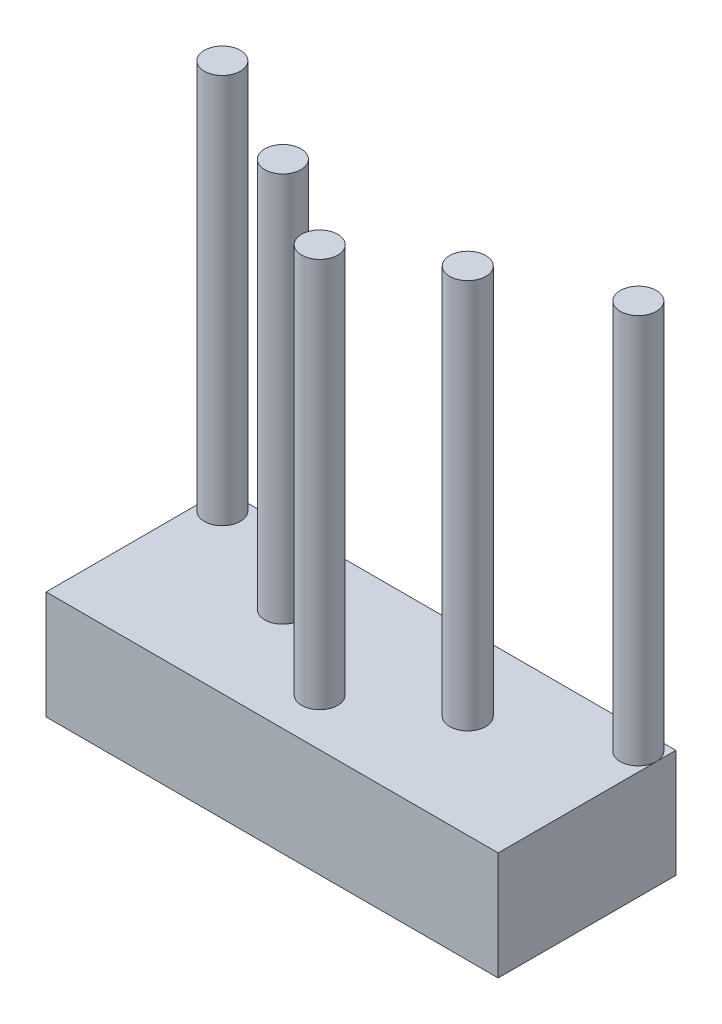
ISO-10303-21;
HEADER;
FILE_DESCRIPTION(('STEP AP214'),'2;1');
FILE_NAME('part.step','',(''),(''),'','','');
FILE_SCHEMA(('AUTOMOTIVE_DESIGN { 1 0 10303 214 1 1 1 1 }'));
ENDSEC;
DATA;
#1=APPLICATION_CONTEXT('core data for automotive mechanical design processes');
#2=APPLICATION_PROTOCOL_DEFINITION('international standard','automotive_design',2000,#1);
#3=PRODUCT_CONTEXT('',#1,'mechanical');
#4=PRODUCT('Part','Part','',(#3));
#5=PRODUCT_RELATED_PRODUCT_CATEGORY('part','',(#4));
#6=PRODUCT_DEFINITION_FORMATION('','',#4);
#7=PRODUCT_DEFINITION_CONTEXT('part definition',#1,'design');
#8=PRODUCT_DEFINITION('design','',#6,#7);
#9=PRODUCT_DEFINITION_SHAPE('','',#8);
#10=(LENGTH_UNIT() NAMED_UNIT(*) SI_UNIT(.MILLI.,.METRE.));
#11=(NAMED_UNIT(*) PLANE_ANGLE_UNIT() SI_UNIT($,.RADIAN.));
#12=(NAMED_UNIT(*) SI_UNIT($,.STERADIAN.) SOLID_ANGLE_UNIT());
#13=UNCERTAINTY_MEASURE_WITH_UNIT(LENGTH_MEASURE(1.E-05),#10,'distance_accuracy_value','');
#14=(GEOMETRIC_REPRESENTATION_CONTEXT(3) GLOBAL_UNCERTAINTY_ASSIGNED_CONTEXT((#13)) GLOBAL_UNIT_ASSIGNED_CONTEXT((#10,
#11,#12)) REPRESENTATION_CONTEXT('',''));
#15=CARTESIAN_POINT('',(0.,0.,0.));
#16=DIRECTION('',(0.,0.,1.));
#17=DIRECTION('',(1.,0.,0.));
#18=AXIS2_PLACEMENT_3D('',#15,#16,#17);
#19=CARTESIAN_POINT('',(-39.751,19.05,-15.621));
#20=DIRECTION('',(1.,0.,0.));
#21=DIRECTION('',(0.,0.,-1.));
#22=AXIS2_PLACEMENT_3D('',#19,#20,#21);
#23=PLANE('',#22);
#24=DIRECTION('',(0.,0.,1.));
#25=VECTOR('',#24,1.);
#26=CARTESIAN_POINT('',(-39.751,0.,-15.621));
#27=LINE('',#26,#25);
#28=CARTESIAN_POINT('',(-39.751,0.,-15.621));
#29=VERTEX_POINT('',#28);
#30=CARTESIAN_POINT('',(-39.751,0.,15.621));
#31=VERTEX_POINT('',#30);
#32=EDGE_CURVE('E110',#29,#31,#27,.T.);
#33=ORIENTED_EDGE('',*,*,#32,.T.);
#34=DIRECTION('',(0.,-1.,0.));
#35=VECTOR('',#34,1.);
#36=CARTESIAN_POINT('',(-39.751,19.05,15.621));
#37=LINE('',#36,#35);
#38=CARTESIAN_POINT('',(-39.751,19.05,15.621));
#39=VERTEX_POINT('',#38);
#40=EDGE_CURVE('E11',#39,#31,#37,.T.);
#41=ORIENTED_EDGE('',*,*,#40,.F.);
#42=DIRECTION('',(0.,0.,1.));
#43=VECTOR('',#42,1.);
#44=CARTESIAN_POINT('',(-39.751,19.05,-15.621));
#45=LINE('',#44,#43);
#46=CARTESIAN_POINT('',(-39.751,19.05,-12.192));
#47=VERTEX_POINT('',#46);
#48=EDGE_CURVE('E85',#47,#39,#45,.T.);
#49=ORIENTED_EDGE('',*,*,#48,.F.);
#50=CARTESIAN_POINT('',(-39.751,19.05,-15.621));
#51=VERTEX_POINT('',#50);
#52=EDGE_CURVE('E89',#51,#47,#45,.T.);
#53=ORIENTED_EDGE('',*,*,#52,.F.);
#54=DIRECTION('',(0.,-1.,0.));
#55=VECTOR('',#54,1.);
#56=CARTESIAN_POINT('',(-39.751,19.05,-15.621));
#57=LINE('',#56,#55);
#58=EDGE_CURVE('E109',#51,#29,#57,.T.);
#59=ORIENTED_EDGE('',*,*,#58,.T.);
#60=EDGE_LOOP('',(#33,#41,#49,#53,#59));
#61=FACE_BOUND('',#60,.T.);
#62=ADVANCED_FACE('F37',(#61),#23,.F.);
#63=CARTESIAN_POINT('',(-39.751,19.05,15.621));
#64=DIRECTION('',(0.,0.,-1.));
#65=DIRECTION('',(-1.,0.,0.));
#66=AXIS2_PLACEMENT_3D('',#63,#64,#65);
#67=PLANE('',#66);
#68=DIRECTION('',(1.,0.,0.));
#69=VECTOR('',#68,1.);
#70=CARTESIAN_POINT('',(-39.751,0.,15.621));
#71=LINE('',#70,#69);
#72=CARTESIAN_POINT('',(39.751,0.,15.621));
#73=VERTEX_POINT('',#72);
#74=EDGE_CURVE('E112',#31,#73,#71,.T.);
#75=ORIENTED_EDGE('',*,*,#74,.T.);
#76=DIRECTION('',(0.,-1.,0.));
#77=VECTOR('',#76,1.);
#78=CARTESIAN_POINT('',(39.751,19.05,15.621));
#79=LINE('',#78,#77);
#80=CARTESIAN_POINT('',(39.751,19.05,15.621));
#81=VERTEX_POINT('',#80);
#82=EDGE_CURVE('E44',#81,#73,#79,.T.);
#83=ORIENTED_EDGE('',*,*,#82,.F.);
#84=DIRECTION('',(1.,0.,0.));
#85=VECTOR('',#84,1.);
#86=CARTESIAN_POINT('',(-39.751,19.05,15.621));
#87=LINE('',#86,#85);
#88=EDGE_CURVE('E95',#39,#81,#87,.T.);
#89=ORIENTED_EDGE('',*,*,#88,.F.);
#90=ORIENTED_EDGE('',*,*,#40,.T.);
#91=EDGE_LOOP('',(#75,#83,#89,#90));
#92=FACE_BOUND('',#91,.T.);
#93=ADVANCED_FACE('F131',(#92),#67,.F.);
#94=CARTESIAN_POINT('',(39.751,19.05,-15.621));
#95=DIRECTION('',(-1.,0.,0.));
#96=DIRECTION('',(0.,0.,1.));
#97=AXIS2_PLACEMENT_3D('',#94,#95,#96);
#98=PLANE('',#97);
#99=DIRECTION('',(0.,0.,-1.));
#100=VECTOR('',#99,1.);
#101=CARTESIAN_POINT('',(39.751,0.,-15.621));
#102=LINE('',#101,#100);
#103=CARTESIAN_POINT('',(39.751,0.,-15.621));
#104=VERTEX_POINT('',#103);
#105=EDGE_CURVE('E99',#73,#104,#102,.T.);
#106=ORIENTED_EDGE('',*,*,#105,.T.);
#107=DIRECTION('',(0.,-1.,0.));
#108=VECTOR('',#107,1.);
#109=CARTESIAN_POINT('',(39.751,19.05,-15.621));
#110=LINE('',#109,#108);
#111=CARTESIAN_POINT('',(39.751,19.05,-15.621));
#112=VERTEX_POINT('',#111);
#113=EDGE_CURVE('E117',#112,#104,#110,.T.);
#114=ORIENTED_EDGE('',*,*,#113,.F.);
#115=DIRECTION('',(0.,0.,-1.));
#116=VECTOR('',#115,1.);
#117=CARTESIAN_POINT('',(39.751,19.05,-15.621));
#118=LINE('',#117,#116);
#119=CARTESIAN_POINT('',(39.751,19.05,-12.192));
#120=VERTEX_POINT('',#119);
#121=EDGE_CURVE('E105',#120,#112,#118,.T.);
#122=ORIENTED_EDGE('',*,*,#121,.F.);
#123=EDGE_CURVE('E106',#81,#120,#118,.T.);
#124=ORIENTED_EDGE('',*,*,#123,.F.);
#125=ORIENTED_EDGE('',*,*,#82,.T.);
#126=EDGE_LOOP('',(#106,#114,#122,#124,#125));
#127=FACE_BOUND('',#126,.T.);
#128=ADVANCED_FACE('F123',(#127),#98,.F.);
#129=CARTESIAN_POINT('',(-39.751,19.05,-15.621));
#130=DIRECTION('',(0.,0.,1.));
#131=DIRECTION('',(1.,0.,0.));
#132=AXIS2_PLACEMENT_3D('',#129,#130,#131);
#133=PLANE('',#132);
#134=DIRECTION('',(-1.,0.,0.));
#135=VECTOR('',#134,1.);
#136=CARTESIAN_POINT('',(-39.751,0.,-15.621));
#137=LINE('',#136,#135);
#138=EDGE_CURVE('E78',#104,#29,#137,.T.);
#139=ORIENTED_EDGE('',*,*,#138,.T.);
#140=ORIENTED_EDGE('',*,*,#58,.F.);
#141=DIRECTION('',(-1.,0.,0.));
#142=VECTOR('',#141,1.);
#143=CARTESIAN_POINT('',(-39.751,19.05,-15.621));
#144=LINE('',#143,#142);
#145=EDGE_CURVE('E57',#112,#51,#144,.T.);
#146=ORIENTED_EDGE('',*,*,#145,.F.);
#147=ORIENTED_EDGE('',*,*,#113,.T.);
#148=EDGE_LOOP('',(#139,#140,#146,#147));
#149=FACE_BOUND('',#148,.T.);
#150=ADVANCED_FACE('F130',(#149),#133,.F.);
#151=CARTESIAN_POINT('',(0.,19.05,0.));
#152=DIRECTION('',(0.,1.,0.));
#153=DIRECTION('',(0.,0.,1.));
#154=AXIS2_PLACEMENT_3D('',#151,#152,#153);
#155=PLANE('',#154);
#156=CARTESIAN_POINT('',(16.256,19.05,-2.51513147919641));
#157=DIRECTION('',(0.,1.,0.));
#158=DIRECTION('',(0.,0.,1.));
#159=AXIS2_PLACEMENT_3D('',#156,#157,#158);
#160=CIRCLE('',#159,3.17499999999999);
#161=CARTESIAN_POINT('',(16.256,19.05,0.659868520803584));
#162=VERTEX_POINT('',#161);
#163=EDGE_CURVE('E190',#162,#162,#160,.T.);
#164=ORIENTED_EDGE('',*,*,#163,.F.);
#165=EDGE_LOOP('',(#164));
#166=FACE_BOUND('',#165,.T.);
#167=CARTESIAN_POINT('',(0.,19.05,7.26386852080359));
#168=DIRECTION('',(0.,1.,0.));
#169=DIRECTION('',(0.,0.,1.));
#170=AXIS2_PLACEMENT_3D('',#167,#168,#169);
#171=CIRCLE('',#170,3.17499999999999);
#172=CARTESIAN_POINT('',(0.,19.05,10.4388685208036));
#173=VERTEX_POINT('',#172);
#174=EDGE_CURVE('E198',#173,#173,#171,.T.);
#175=ORIENTED_EDGE('',*,*,#174,.F.);
#176=EDGE_LOOP('',(#175));
#177=FACE_BOUND('',#176,.T.);
#178=CARTESIAN_POINT('',(-16.256,19.05,-2.51513147919641));
#179=DIRECTION('',(0.,1.,0.));
#180=DIRECTION('',(0.,0.,1.));
#181=AXIS2_PLACEMENT_3D('',#178,#179,#180);
#182=CIRCLE('',#181,3.17499999999999);
#183=CARTESIAN_POINT('',(-16.256,19.05,0.659868520803584));
#184=VERTEX_POINT('',#183);
#185=EDGE_CURVE('E203',#184,#184,#182,.T.);
#186=ORIENTED_EDGE('',*,*,#185,.F.);
#187=EDGE_LOOP('',(#186));
#188=FACE_BOUND('',#187,.T.);
#189=ORIENTED_EDGE('',*,*,#123,.T.);
#190=CARTESIAN_POINT('',(36.576,19.05,-12.192));
#191=DIRECTION('',(0.,1.,0.));
#192=DIRECTION('',(0.,0.,1.));
#193=AXIS2_PLACEMENT_3D('',#190,#191,#192);
#194=CIRCLE('',#193,3.175);
#195=EDGE_CURVE('E49',#120,#120,#194,.T.);
#196=ORIENTED_EDGE('',*,*,#195,.F.);
#197=ORIENTED_EDGE('',*,*,#121,.T.);
#198=ORIENTED_EDGE('',*,*,#145,.T.);
#199=ORIENTED_EDGE('',*,*,#52,.T.);
#200=CARTESIAN_POINT('',(-36.576,19.05,-12.192));
#201=DIRECTION('',(0.,1.,0.));
#202=DIRECTION('',(0.,0.,1.));
#203=AXIS2_PLACEMENT_3D('',#200,#201,#202);
#204=CIRCLE('',#203,3.17499999999999);
#205=EDGE_CURVE('E93',#47,#47,#204,.T.);
#206=ORIENTED_EDGE('',*,*,#205,.F.);
#207=ORIENTED_EDGE('',*,*,#48,.T.);
#208=ORIENTED_EDGE('',*,*,#88,.T.);
#209=EDGE_LOOP('',(#189,#196,#197,#198,#199,#206,#207,#208));
#210=FACE_BOUND('',#209,.T.);
#211=ADVANCED_FACE('F91',(#166,#177,#188,#210),#155,.T.);
#212=CARTESIAN_POINT('',(0.,0.,0.));
#213=DIRECTION('',(0.,1.,0.));
#214=DIRECTION('',(0.,0.,1.));
#215=AXIS2_PLACEMENT_3D('',#212,#213,#214);
#216=PLANE('',#215);
#217=ORIENTED_EDGE('',*,*,#32,.F.);
#218=ORIENTED_EDGE('',*,*,#138,.F.);
#219=ORIENTED_EDGE('',*,*,#105,.F.);
#220=ORIENTED_EDGE('',*,*,#74,.F.);
#221=EDGE_LOOP('',(#217,#218,#219,#220));
#222=FACE_BOUND('',#221,.T.);
#223=ADVANCED_FACE('F129',(#222),#216,.F.);
#224=CARTESIAN_POINT('',(-36.576,87.63,-12.192));
#225=DIRECTION('',(0.,-1.,0.));
#226=DIRECTION('',(0.,0.,-1.));
#227=AXIS2_PLACEMENT_3D('',#224,#225,#226);
#228=CYLINDRICAL_SURFACE('',#227,3.17499999999999);
#229=CARTESIAN_POINT('',(-36.576,87.63,-12.192));
#230=DIRECTION('',(0.,1.,0.));
#231=DIRECTION('',(0.,0.,1.));
#232=AXIS2_PLACEMENT_3D('',#229,#230,#231);
#233=CIRCLE('',#232,3.17499999999999);
#234=CARTESIAN_POINT('',(-36.576,87.63,-9.01700000000001));
#235=VERTEX_POINT('',#234);
#236=EDGE_CURVE('E113',#235,#235,#233,.T.);
#237=ORIENTED_EDGE('',*,*,#236,.F.);
#238=EDGE_LOOP('',(#237));
#239=FACE_BOUND('',#238,.T.);
#240=ORIENTED_EDGE('',*,*,#205,.T.);
#241=EDGE_LOOP('',(#240));
#242=FACE_BOUND('',#241,.T.);
#243=ADVANCED_FACE('F143',(#239,#242),#228,.T.);
#244=CARTESIAN_POINT('',(-36.576,87.63,-12.192));
#245=DIRECTION('',(0.,1.,0.));
#246=DIRECTION('',(0.,0.,1.));
#247=AXIS2_PLACEMENT_3D('',#244,#245,#246);
#248=PLANE('',#247);
#249=ORIENTED_EDGE('',*,*,#236,.T.);
#250=EDGE_LOOP('',(#249));
#251=FACE_BOUND('',#250,.T.);
#252=ADVANCED_FACE('F149',(#251),#248,.T.);
#253=CARTESIAN_POINT('',(-16.256,87.63,-2.51513147919641));
#254=DIRECTION('',(0.,-1.,0.));
#255=DIRECTION('',(0.,0.,-1.));
#256=AXIS2_PLACEMENT_3D('',#253,#254,#255);
#257=CYLINDRICAL_SURFACE('',#256,3.17499999999999);
#258=CARTESIAN_POINT('',(-16.256,87.63,-2.51513147919641));
#259=DIRECTION('',(0.,1.,0.));
#260=DIRECTION('',(0.,0.,1.));
#261=AXIS2_PLACEMENT_3D('',#258,#259,#260);
#262=CIRCLE('',#261,3.17499999999999);
#263=CARTESIAN_POINT('',(-16.256,87.63,0.659868520803584));
#264=VERTEX_POINT('',#263);
#265=EDGE_CURVE('E206',#264,#264,#262,.T.);
#266=ORIENTED_EDGE('',*,*,#265,.F.);
#267=EDGE_LOOP('',(#266));
#268=FACE_BOUND('',#267,.T.);
#269=ORIENTED_EDGE('',*,*,#185,.T.);
#270=EDGE_LOOP('',(#269));
#271=FACE_BOUND('',#270,.T.);
#272=ADVANCED_FACE('F153',(#268,#271),#257,.T.);
#273=CARTESIAN_POINT('',(-16.256,87.63,-2.51513147919641));
#274=DIRECTION('',(0.,1.,0.));
#275=DIRECTION('',(0.,0.,1.));
#276=AXIS2_PLACEMENT_3D('',#273,#274,#275);
#277=PLANE('',#276);
#278=ORIENTED_EDGE('',*,*,#265,.T.);
#279=EDGE_LOOP('',(#278));
#280=FACE_BOUND('',#279,.T.);
#281=ADVANCED_FACE('F157',(#280),#277,.T.);
#282=CARTESIAN_POINT('',(0.,87.63,7.26386852080359));
#283=DIRECTION('',(0.,-1.,0.));
#284=DIRECTION('',(0.,0.,-1.));
#285=AXIS2_PLACEMENT_3D('',#282,#283,#284);
#286=CYLINDRICAL_SURFACE('',#285,3.17499999999999);
#287=CARTESIAN_POINT('',(0.,87.63,7.26386852080359));
#288=DIRECTION('',(0.,1.,0.));
#289=DIRECTION('',(0.,0.,1.));
#290=AXIS2_PLACEMENT_3D('',#287,#288,#289);
#291=CIRCLE('',#290,3.17499999999999);
#292=CARTESIAN_POINT('',(0.,87.63,10.4388685208036));
#293=VERTEX_POINT('',#292);
#294=EDGE_CURVE('E200',#293,#293,#291,.T.);
#295=ORIENTED_EDGE('',*,*,#294,.F.);
#296=EDGE_LOOP('',(#295));
#297=FACE_BOUND('',#296,.T.);
#298=ORIENTED_EDGE('',*,*,#174,.T.);
#299=EDGE_LOOP('',(#298));
#300=FACE_BOUND('',#299,.T.);
#301=ADVANCED_FACE('F161',(#297,#300),#286,.T.);
#302=CARTESIAN_POINT('',(0.,87.63,7.26386852080359));
#303=DIRECTION('',(0.,1.,0.));
#304=DIRECTION('',(0.,0.,1.));
#305=AXIS2_PLACEMENT_3D('',#302,#303,#304);
#306=PLANE('',#305);
#307=ORIENTED_EDGE('',*,*,#294,.T.);
#308=EDGE_LOOP('',(#307));
#309=FACE_BOUND('',#308,.T.);
#310=ADVANCED_FACE('F165',(#309),#306,.T.);
#311=CARTESIAN_POINT('',(16.256,87.63,-2.51513147919641));
#312=DIRECTION('',(0.,-1.,0.));
#313=DIRECTION('',(0.,0.,-1.));
#314=AXIS2_PLACEMENT_3D('',#311,#312,#313);
#315=CYLINDRICAL_SURFACE('',#314,3.17499999999999);
#316=CARTESIAN_POINT('',(16.256,87.63,-2.51513147919641));
#317=DIRECTION('',(0.,1.,0.));
#318=DIRECTION('',(0.,0.,1.));
#319=AXIS2_PLACEMENT_3D('',#316,#317,#318);
#320=CIRCLE('',#319,3.17499999999999);
#321=CARTESIAN_POINT('',(16.256,87.63,0.659868520803584));
#322=VERTEX_POINT('',#321);
#323=EDGE_CURVE('E193',#322,#322,#320,.T.);
#324=ORIENTED_EDGE('',*,*,#323,.F.);
#325=EDGE_LOOP('',(#324));
#326=FACE_BOUND('',#325,.T.);
#327=ORIENTED_EDGE('',*,*,#163,.T.);
#328=EDGE_LOOP('',(#327));
#329=FACE_BOUND('',#328,.T.);
#330=ADVANCED_FACE('F169',(#326,#329),#315,.T.);
#331=CARTESIAN_POINT('',(16.256,87.63,-2.51513147919641));
#332=DIRECTION('',(0.,1.,0.));
#333=DIRECTION('',(0.,0.,1.));
#334=AXIS2_PLACEMENT_3D('',#331,#332,#333);
#335=PLANE('',#334);
#336=ORIENTED_EDGE('',*,*,#323,.T.);
#337=EDGE_LOOP('',(#336));
#338=FACE_BOUND('',#337,.T.);
#339=ADVANCED_FACE('F173',(#338),#335,.T.);
#340=CARTESIAN_POINT('',(36.576,87.63,-12.192));
#341=DIRECTION('',(0.,-1.,0.));
#342=DIRECTION('',(0.,0.,-1.));
#343=AXIS2_PLACEMENT_3D('',#340,#341,#342);
#344=CYLINDRICAL_SURFACE('',#343,3.175);
#345=CARTESIAN_POINT('',(36.576,87.63,-12.192));
#346=DIRECTION('',(0.,1.,0.));
#347=DIRECTION('',(0.,0.,1.));
#348=AXIS2_PLACEMENT_3D('',#345,#346,#347);
#349=CIRCLE('',#348,3.175);
#350=CARTESIAN_POINT('',(36.576,87.63,-9.017));
#351=VERTEX_POINT('',#350);
#352=EDGE_CURVE('E189',#351,#351,#349,.T.);
#353=ORIENTED_EDGE('',*,*,#352,.F.);
#354=EDGE_LOOP('',(#353));
#355=FACE_BOUND('',#354,.T.);
#356=ORIENTED_EDGE('',*,*,#195,.T.);
#357=EDGE_LOOP('',(#356));
#358=FACE_BOUND('',#357,.T.);
#359=ADVANCED_FACE('F177',(#355,#358),#344,.T.);
#360=CARTESIAN_POINT('',(36.576,87.63,-12.192));
#361=DIRECTION('',(0.,1.,0.));
#362=DIRECTION('',(0.,0.,1.));
#363=AXIS2_PLACEMENT_3D('',#360,#361,#362);
#364=PLANE('',#363);
#365=ORIENTED_EDGE('',*,*,#352,.T.);
#366=EDGE_LOOP('',(#365));
#367=FACE_BOUND('',#366,.T.);
#368=ADVANCED_FACE('F181',(#367),#364,.T.);
#369=CLOSED_SHELL('',(#62,#93,#128,#150,#211,#223,#243,#252,#272,#281,#301,#310,#330,#339,#359,#368));
#370=MANIFOLD_SOLID_BREP('B2',#369);
#371=ADVANCED_BREP_SHAPE_REPRESENTATION('',(#18,#370),#14);
#372=SHAPE_DEFINITION_REPRESENTATION(#9,#371);
ENDSEC;
END-ISO-10303-21;
